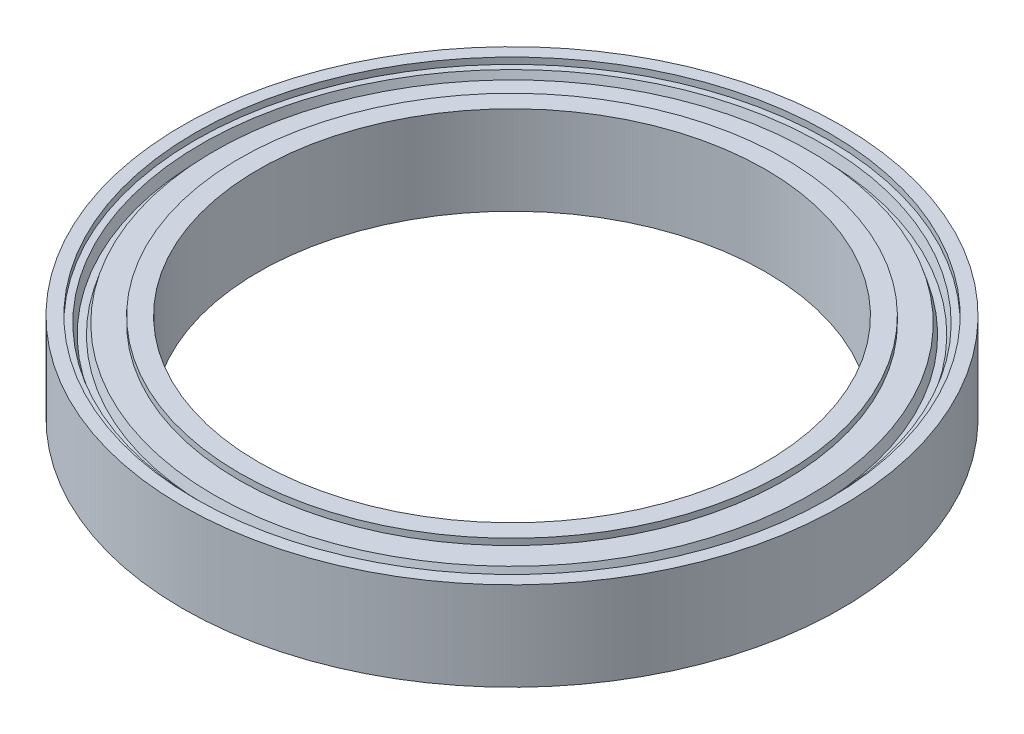
ISO-10303-21;
HEADER;
FILE_DESCRIPTION(('STEP AP214'),'2;1');
FILE_NAME('part.step','',(''),(''),'','','');
FILE_SCHEMA(('AUTOMOTIVE_DESIGN { 1 0 10303 214 1 1 1 1 }'));
ENDSEC;
DATA;
#1=APPLICATION_CONTEXT('core data for automotive mechanical design processes');
#2=APPLICATION_PROTOCOL_DEFINITION('international standard','automotive_design',2000,#1);
#3=PRODUCT_CONTEXT('',#1,'mechanical');
#4=PRODUCT('Part','Part','',(#3));
#5=PRODUCT_RELATED_PRODUCT_CATEGORY('part','',(#4));
#6=PRODUCT_DEFINITION_FORMATION('','',#4);
#7=PRODUCT_DEFINITION_CONTEXT('part definition',#1,'design');
#8=PRODUCT_DEFINITION('design','',#6,#7);
#9=PRODUCT_DEFINITION_SHAPE('','',#8);
#10=(LENGTH_UNIT() NAMED_UNIT(*) SI_UNIT(.MILLI.,.METRE.));
#11=(NAMED_UNIT(*) PLANE_ANGLE_UNIT() SI_UNIT($,.RADIAN.));
#12=(NAMED_UNIT(*) SI_UNIT($,.STERADIAN.) SOLID_ANGLE_UNIT());
#13=UNCERTAINTY_MEASURE_WITH_UNIT(LENGTH_MEASURE(1.E-05),#10,'distance_accuracy_value','');
#14=(GEOMETRIC_REPRESENTATION_CONTEXT(3) GLOBAL_UNCERTAINTY_ASSIGNED_CONTEXT((#13)) GLOBAL_UNIT_ASSIGNED_CONTEXT((#10,
#11,#12)) REPRESENTATION_CONTEXT('',''));
#15=CARTESIAN_POINT('',(0.,0.,0.));
#16=DIRECTION('',(0.,0.,1.));
#17=DIRECTION('',(1.,0.,0.));
#18=AXIS2_PLACEMENT_3D('',#15,#16,#17);
#19=CARTESIAN_POINT('',(0.,6.5,0.));
#20=DIRECTION('',(0.,1.,0.));
#21=DIRECTION('',(0.,0.,1.));
#22=AXIS2_PLACEMENT_3D('',#19,#20,#21);
#23=PLANE('',#22);
#24=CARTESIAN_POINT('',(0.,6.5,0.));
#25=DIRECTION('',(0.,1.,0.));
#26=DIRECTION('',(0.,0.,1.));
#27=AXIS2_PLACEMENT_3D('',#24,#25,#26);
#28=CIRCLE('',#27,21.5);
#29=CARTESIAN_POINT('',(0.,6.5,21.5));
#30=VERTEX_POINT('',#29);
#31=EDGE_CURVE('E59',#30,#30,#28,.T.);
#32=ORIENTED_EDGE('',*,*,#31,.F.);
#33=EDGE_LOOP('',(#32));
#34=FACE_BOUND('',#33,.T.);
#35=CARTESIAN_POINT('',(0.,6.5,0.));
#36=DIRECTION('',(0.,1.,0.));
#37=DIRECTION('',(0.,0.,1.));
#38=AXIS2_PLACEMENT_3D('',#35,#36,#37);
#39=CIRCLE('',#38,23.5);
#40=CARTESIAN_POINT('',(0.,6.5,23.5));
#41=VERTEX_POINT('',#40);
#42=EDGE_CURVE('E74',#41,#41,#39,.T.);
#43=ORIENTED_EDGE('',*,*,#42,.T.);
#44=EDGE_LOOP('',(#43));
#45=FACE_BOUND('',#44,.T.);
#46=ADVANCED_FACE('F37',(#34,#45),#23,.T.);
#47=CARTESIAN_POINT('',(0.,7.,0.));
#48=DIRECTION('',(0.,1.,0.));
#49=DIRECTION('',(0.,0.,1.));
#50=AXIS2_PLACEMENT_3D('',#47,#48,#49);
#51=PLANE('',#50);
#52=CARTESIAN_POINT('',(0.,7.,0.));
#53=DIRECTION('',(0.,1.,0.));
#54=DIRECTION('',(0.,0.,1.));
#55=AXIS2_PLACEMENT_3D('',#52,#53,#54);
#56=CIRCLE('',#55,20.);
#57=CARTESIAN_POINT('',(0.,7.,20.));
#58=VERTEX_POINT('',#57);
#59=EDGE_CURVE('E48',#58,#58,#56,.T.);
#60=ORIENTED_EDGE('',*,*,#59,.F.);
#61=EDGE_LOOP('',(#60));
#62=FACE_BOUND('',#61,.T.);
#63=CARTESIAN_POINT('',(0.,7.,0.));
#64=DIRECTION('',(0.,1.,0.));
#65=DIRECTION('',(0.,0.,1.));
#66=AXIS2_PLACEMENT_3D('',#63,#64,#65);
#67=CIRCLE('',#66,21.5);
#68=CARTESIAN_POINT('',(0.,7.,21.5));
#69=VERTEX_POINT('',#68);
#70=EDGE_CURVE('E62',#69,#69,#67,.T.);
#71=ORIENTED_EDGE('',*,*,#70,.T.);
#72=EDGE_LOOP('',(#71));
#73=FACE_BOUND('',#72,.T.);
#74=ADVANCED_FACE('F94',(#62,#73),#51,.T.);
#75=CARTESIAN_POINT('',(0.,7.,0.));
#76=DIRECTION('',(0.,1.,0.));
#77=DIRECTION('',(0.,0.,1.));
#78=AXIS2_PLACEMENT_3D('',#75,#76,#77);
#79=CIRCLE('',#78,25.);
#80=CARTESIAN_POINT('',(0.,7.,25.));
#81=VERTEX_POINT('',#80);
#82=EDGE_CURVE('E56',#81,#81,#79,.T.);
#83=ORIENTED_EDGE('',*,*,#82,.F.);
#84=EDGE_LOOP('',(#83));
#85=FACE_BOUND('',#84,.T.);
#86=CARTESIAN_POINT('',(0.,7.,0.));
#87=DIRECTION('',(0.,1.,0.));
#88=DIRECTION('',(0.,0.,1.));
#89=AXIS2_PLACEMENT_3D('',#86,#87,#88);
#90=CIRCLE('',#89,26.);
#91=CARTESIAN_POINT('',(0.,7.,26.));
#92=VERTEX_POINT('',#91);
#93=EDGE_CURVE('E10',#92,#92,#90,.T.);
#94=ORIENTED_EDGE('',*,*,#93,.T.);
#95=EDGE_LOOP('',(#94));
#96=FACE_BOUND('',#95,.T.);
#97=ADVANCED_FACE('F101',(#85,#96),#51,.T.);
#98=CARTESIAN_POINT('',(0.,0.,0.));
#99=DIRECTION('',(0.,1.,0.));
#100=DIRECTION('',(0.,0.,1.));
#101=AXIS2_PLACEMENT_3D('',#98,#99,#100);
#102=PLANE('',#101);
#103=CARTESIAN_POINT('',(0.,0.,0.));
#104=DIRECTION('',(0.,1.,0.));
#105=DIRECTION('',(0.,0.,1.));
#106=AXIS2_PLACEMENT_3D('',#103,#104,#105);
#107=CIRCLE('',#106,26.);
#108=CARTESIAN_POINT('',(0.,0.,26.));
#109=VERTEX_POINT('',#108);
#110=EDGE_CURVE('E41',#109,#109,#107,.T.);
#111=ORIENTED_EDGE('',*,*,#110,.F.);
#112=EDGE_LOOP('',(#111));
#113=FACE_BOUND('',#112,.T.);
#114=CARTESIAN_POINT('',(0.,0.,0.));
#115=DIRECTION('',(0.,1.,0.));
#116=DIRECTION('',(0.,0.,1.));
#117=AXIS2_PLACEMENT_3D('',#114,#115,#116);
#118=CIRCLE('',#117,20.);
#119=CARTESIAN_POINT('',(0.,0.,20.));
#120=VERTEX_POINT('',#119);
#121=EDGE_CURVE('E50',#120,#120,#118,.T.);
#122=ORIENTED_EDGE('',*,*,#121,.T.);
#123=EDGE_LOOP('',(#122));
#124=FACE_BOUND('',#123,.T.);
#125=ADVANCED_FACE('F125',(#113,#124),#102,.F.);
#126=CARTESIAN_POINT('',(0.,7.,0.));
#127=DIRECTION('',(0.,-1.,0.));
#128=DIRECTION('',(0.,0.,-1.));
#129=AXIS2_PLACEMENT_3D('',#126,#127,#128);
#130=CYLINDRICAL_SURFACE('',#129,26.);
#131=ORIENTED_EDGE('',*,*,#93,.F.);
#132=EDGE_LOOP('',(#131));
#133=FACE_BOUND('',#132,.T.);
#134=ORIENTED_EDGE('',*,*,#110,.T.);
#135=EDGE_LOOP('',(#134));
#136=FACE_BOUND('',#135,.T.);
#137=ADVANCED_FACE('F39',(#133,#136),#130,.T.);
#138=CARTESIAN_POINT('',(0.,7.,0.));
#139=DIRECTION('',(0.,-1.,0.));
#140=DIRECTION('',(0.,0.,-1.));
#141=AXIS2_PLACEMENT_3D('',#138,#139,#140);
#142=CYLINDRICAL_SURFACE('',#141,20.);
#143=ORIENTED_EDGE('',*,*,#59,.T.);
#144=EDGE_LOOP('',(#143));
#145=FACE_BOUND('',#144,.T.);
#146=ORIENTED_EDGE('',*,*,#121,.F.);
#147=EDGE_LOOP('',(#146));
#148=FACE_BOUND('',#147,.T.);
#149=ADVANCED_FACE('F116',(#145,#148),#142,.F.);
#150=CARTESIAN_POINT('',(0.,6.5,0.));
#151=DIRECTION('',(0.,1.,0.));
#152=DIRECTION('',(0.,0.,1.));
#153=AXIS2_PLACEMENT_3D('',#150,#151,#152);
#154=CYLINDRICAL_SURFACE('',#153,25.);
#155=CARTESIAN_POINT('',(0.,6.5,0.));
#156=DIRECTION('',(0.,1.,0.));
#157=DIRECTION('',(0.,0.,1.));
#158=AXIS2_PLACEMENT_3D('',#155,#156,#157);
#159=CIRCLE('',#158,25.);
#160=CARTESIAN_POINT('',(0.,6.5,25.));
#161=VERTEX_POINT('',#160);
#162=EDGE_CURVE('E53',#161,#161,#159,.T.);
#163=ORIENTED_EDGE('',*,*,#162,.F.);
#164=EDGE_LOOP('',(#163));
#165=FACE_BOUND('',#164,.T.);
#166=ORIENTED_EDGE('',*,*,#82,.T.);
#167=EDGE_LOOP('',(#166));
#168=FACE_BOUND('',#167,.T.);
#169=ADVANCED_FACE('F109',(#165,#168),#154,.F.);
#170=CARTESIAN_POINT('',(0.,6.5,0.));
#171=DIRECTION('',(0.,1.,0.));
#172=DIRECTION('',(0.,0.,1.));
#173=AXIS2_PLACEMENT_3D('',#170,#171,#172);
#174=CIRCLE('',#173,24.5);
#175=CARTESIAN_POINT('',(0.,6.5,24.5));
#176=VERTEX_POINT('',#175);
#177=EDGE_CURVE('E70',#176,#176,#174,.T.);
#178=ORIENTED_EDGE('',*,*,#177,.F.);
#179=EDGE_LOOP('',(#178));
#180=FACE_BOUND('',#179,.T.);
#181=ORIENTED_EDGE('',*,*,#162,.T.);
#182=EDGE_LOOP('',(#181));
#183=FACE_BOUND('',#182,.T.);
#184=ADVANCED_FACE('F97',(#180,#183),#23,.T.);
#185=CARTESIAN_POINT('',(0.,6.5,0.));
#186=DIRECTION('',(0.,1.,0.));
#187=DIRECTION('',(0.,0.,1.));
#188=AXIS2_PLACEMENT_3D('',#185,#186,#187);
#189=CYLINDRICAL_SURFACE('',#188,21.5);
#190=ORIENTED_EDGE('',*,*,#31,.T.);
#191=EDGE_LOOP('',(#190));
#192=FACE_BOUND('',#191,.T.);
#193=ORIENTED_EDGE('',*,*,#70,.F.);
#194=EDGE_LOOP('',(#193));
#195=FACE_BOUND('',#194,.T.);
#196=ADVANCED_FACE('F108',(#192,#195),#189,.T.);
#197=CARTESIAN_POINT('',(0.,6.5,0.));
#198=DIRECTION('',(0.,1.,0.));
#199=DIRECTION('',(0.,0.,1.));
#200=AXIS2_PLACEMENT_3D('',#197,#198,#199);
#201=CONICAL_SURFACE('',#200,24.5,0.296705972839036);
#202=CARTESIAN_POINT('',(0.,5.7,0.));
#203=DIRECTION('',(0.,1.,0.));
#204=DIRECTION('',(0.,0.,1.));
#205=AXIS2_PLACEMENT_3D('',#202,#203,#204);
#206=CIRCLE('',#205,24.2554154548331);
#207=CARTESIAN_POINT('',(0.,5.7,24.2554154548331));
#208=VERTEX_POINT('',#207);
#209=EDGE_CURVE('E65',#208,#208,#206,.T.);
#210=ORIENTED_EDGE('',*,*,#209,.F.);
#211=EDGE_LOOP('',(#210));
#212=FACE_BOUND('',#211,.T.);
#213=ORIENTED_EDGE('',*,*,#177,.T.);
#214=EDGE_LOOP('',(#213));
#215=FACE_BOUND('',#214,.T.);
#216=ADVANCED_FACE('F89',(#212,#215),#201,.F.);
#217=CARTESIAN_POINT('',(0.,5.7,0.));
#218=DIRECTION('',(0.,1.,0.));
#219=DIRECTION('',(0.,0.,1.));
#220=AXIS2_PLACEMENT_3D('',#217,#218,#219);
#221=PLANE('',#220);
#222=CARTESIAN_POINT('',(0.,5.7,0.));
#223=DIRECTION('',(0.,1.,0.));
#224=DIRECTION('',(0.,0.,1.));
#225=AXIS2_PLACEMENT_3D('',#222,#223,#224);
#226=CIRCLE('',#225,23.7445845451669);
#227=CARTESIAN_POINT('',(0.,5.7,23.7445845451669));
#228=VERTEX_POINT('',#227);
#229=EDGE_CURVE('E71',#228,#228,#226,.T.);
#230=ORIENTED_EDGE('',*,*,#229,.F.);
#231=EDGE_LOOP('',(#230));
#232=FACE_BOUND('',#231,.T.);
#233=ORIENTED_EDGE('',*,*,#209,.T.);
#234=EDGE_LOOP('',(#233));
#235=FACE_BOUND('',#234,.T.);
#236=ADVANCED_FACE('F83',(#232,#235),#221,.T.);
#237=CARTESIAN_POINT('',(0.,6.5,0.));
#238=DIRECTION('',(0.,-1.,0.));
#239=DIRECTION('',(0.,0.,1.));
#240=AXIS2_PLACEMENT_3D('',#237,#238,#239);
#241=CONICAL_SURFACE('',#240,23.5,0.296705972839036);
#242=ORIENTED_EDGE('',*,*,#229,.T.);
#243=EDGE_LOOP('',(#242));
#244=FACE_BOUND('',#243,.T.);
#245=ORIENTED_EDGE('',*,*,#42,.F.);
#246=EDGE_LOOP('',(#245));
#247=FACE_BOUND('',#246,.T.);
#248=ADVANCED_FACE('F81',(#244,#247),#241,.T.);
#249=CLOSED_SHELL('',(#46,#74,#97,#125,#137,#149,#169,#184,#196,#216,#236,#248));
#250=MANIFOLD_SOLID_BREP('B2',#249);
#251=ADVANCED_BREP_SHAPE_REPRESENTATION('',(#18,#250),#14);
#252=SHAPE_DEFINITION_REPRESENTATION(#9,#251);
ENDSEC;
END-ISO-10303-21;
